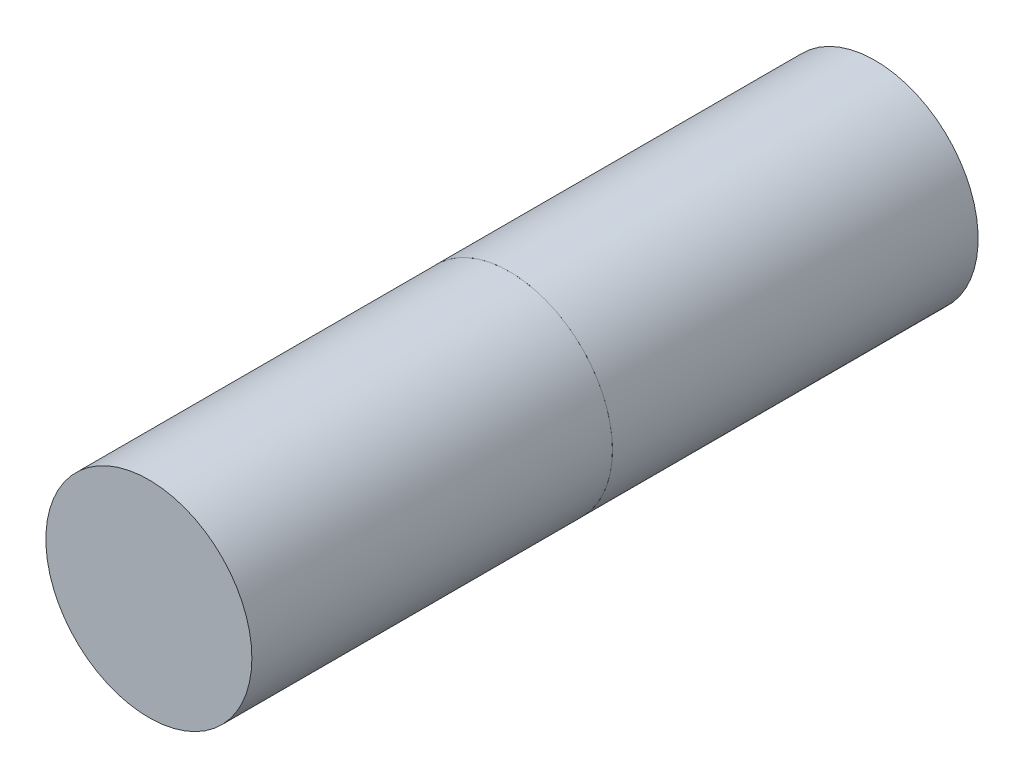
ISO-10303-21;
HEADER;
FILE_DESCRIPTION(('STEP AP214'),'2;1');
FILE_NAME('part.step','',(''),(''),'','','');
FILE_SCHEMA(('AUTOMOTIVE_DESIGN { 1 0 10303 214 1 1 1 1 }'));
ENDSEC;
DATA;
#1=APPLICATION_CONTEXT('core data for automotive mechanical design processes');
#2=APPLICATION_PROTOCOL_DEFINITION('international standard','automotive_design',2000,#1);
#3=PRODUCT_CONTEXT('',#1,'mechanical');
#4=PRODUCT('Part','Part','',(#3));
#5=PRODUCT_RELATED_PRODUCT_CATEGORY('part','',(#4));
#6=PRODUCT_DEFINITION_FORMATION('','',#4);
#7=PRODUCT_DEFINITION_CONTEXT('part definition',#1,'design');
#8=PRODUCT_DEFINITION('design','',#6,#7);
#9=PRODUCT_DEFINITION_SHAPE('','',#8);
#10=(LENGTH_UNIT() NAMED_UNIT(*) SI_UNIT(.MILLI.,.METRE.));
#11=(NAMED_UNIT(*) PLANE_ANGLE_UNIT() SI_UNIT($,.RADIAN.));
#12=(NAMED_UNIT(*) SI_UNIT($,.STERADIAN.) SOLID_ANGLE_UNIT());
#13=UNCERTAINTY_MEASURE_WITH_UNIT(LENGTH_MEASURE(1.E-05),#10,'distance_accuracy_value','');
#14=(GEOMETRIC_REPRESENTATION_CONTEXT(3) GLOBAL_UNCERTAINTY_ASSIGNED_CONTEXT((#13)) GLOBAL_UNIT_ASSIGNED_CONTEXT((#10,
#11,#12)) REPRESENTATION_CONTEXT('',''));
#15=CARTESIAN_POINT('',(0.,0.,0.));
#16=DIRECTION('',(0.,0.,1.));
#17=DIRECTION('',(1.,0.,0.));
#18=AXIS2_PLACEMENT_3D('',#15,#16,#17);
#19=CARTESIAN_POINT('',(0.,0.,-7.1));
#20=DIRECTION('',(0.,0.,1.));
#21=DIRECTION('',(1.,0.,0.));
#22=AXIS2_PLACEMENT_3D('',#19,#20,#21);
#23=CYLINDRICAL_SURFACE('',#22,2.);
#24=CARTESIAN_POINT('',(0.,0.,-7.1));
#25=DIRECTION('',(0.,0.,-1.));
#26=DIRECTION('',(-1.,0.,0.));
#27=AXIS2_PLACEMENT_3D('',#24,#25,#26);
#28=CIRCLE('',#27,2.);
#29=CARTESIAN_POINT('',(-2.,0.,-7.1));
#30=VERTEX_POINT('',#29);
#31=EDGE_CURVE('E11',#30,#30,#28,.T.);
#32=ORIENTED_EDGE('',*,*,#31,.F.);
#33=EDGE_LOOP('',(#32));
#34=FACE_BOUND('',#33,.T.);
#35=CARTESIAN_POINT('',(0.,0.,0.));
#36=DIRECTION('',(0.,0.,-1.));
#37=DIRECTION('',(-1.,0.,0.));
#38=AXIS2_PLACEMENT_3D('',#35,#36,#37);
#39=CIRCLE('',#38,2.);
#40=CARTESIAN_POINT('',(-2.,0.,0.));
#41=VERTEX_POINT('',#40);
#42=EDGE_CURVE('E54',#41,#41,#39,.T.);
#43=ORIENTED_EDGE('',*,*,#42,.T.);
#44=EDGE_LOOP('',(#43));
#45=FACE_BOUND('',#44,.T.);
#46=ADVANCED_FACE('F51',(#34,#45),#23,.T.);
#47=CARTESIAN_POINT('',(0.,0.,-7.1));
#48=DIRECTION('',(0.,0.,-1.));
#49=DIRECTION('',(-1.,0.,0.));
#50=AXIS2_PLACEMENT_3D('',#47,#48,#49);
#51=PLANE('',#50);
#52=ORIENTED_EDGE('',*,*,#31,.T.);
#53=EDGE_LOOP('',(#52));
#54=FACE_BOUND('',#53,.T.);
#55=ADVANCED_FACE('F68',(#54),#51,.T.);
#56=CARTESIAN_POINT('',(0.,0.,0.));
#57=DIRECTION('',(0.,0.,-1.));
#58=DIRECTION('',(-1.,0.,0.));
#59=AXIS2_PLACEMENT_3D('',#56,#57,#58);
#60=PLANE('',#59);
#61=ORIENTED_EDGE('',*,*,#42,.F.);
#62=EDGE_LOOP('',(#61));
#63=FACE_BOUND('',#62,.T.);
#64=ADVANCED_FACE('F66',(#63),#60,.F.);
#65=CLOSED_SHELL('',(#46,#55,#64));
#66=MANIFOLD_SOLID_BREP('B2',#65);
#67=CARTESIAN_POINT('',(0.,0.,7.));
#68=DIRECTION('',(0.,0.,-1.));
#69=DIRECTION('',(-1.,0.,0.));
#70=AXIS2_PLACEMENT_3D('',#67,#68,#69);
#71=CYLINDRICAL_SURFACE('',#70,2.);
#72=CARTESIAN_POINT('',(0.,0.,7.));
#73=DIRECTION('',(0.,0.,1.));
#74=DIRECTION('',(1.,0.,0.));
#75=AXIS2_PLACEMENT_3D('',#72,#73,#74);
#76=CIRCLE('',#75,2.);
#77=CARTESIAN_POINT('',(2.,0.,7.));
#78=VERTEX_POINT('',#77);
#79=EDGE_CURVE('E50',#78,#78,#76,.T.);
#80=ORIENTED_EDGE('',*,*,#79,.F.);
#81=EDGE_LOOP('',(#80));
#82=FACE_BOUND('',#81,.T.);
#83=CARTESIAN_POINT('',(0.,0.,0.));
#84=DIRECTION('',(0.,0.,1.));
#85=DIRECTION('',(1.,0.,0.));
#86=AXIS2_PLACEMENT_3D('',#83,#84,#85);
#87=CIRCLE('',#86,2.);
#88=CARTESIAN_POINT('',(2.,0.,0.));
#89=VERTEX_POINT('',#88);
#90=EDGE_CURVE('E103',#89,#89,#87,.T.);
#91=ORIENTED_EDGE('',*,*,#90,.T.);
#92=EDGE_LOOP('',(#91));
#93=FACE_BOUND('',#92,.T.);
#94=ADVANCED_FACE('F100',(#82,#93),#71,.T.);
#95=CARTESIAN_POINT('',(0.,0.,7.));
#96=DIRECTION('',(0.,0.,1.));
#97=DIRECTION('',(1.,0.,0.));
#98=AXIS2_PLACEMENT_3D('',#95,#96,#97);
#99=PLANE('',#98);
#100=ORIENTED_EDGE('',*,*,#79,.T.);
#101=EDGE_LOOP('',(#100));
#102=FACE_BOUND('',#101,.T.);
#103=ADVANCED_FACE('F115',(#102),#99,.T.);
#104=CARTESIAN_POINT('',(0.,0.,0.));
#105=DIRECTION('',(0.,0.,1.));
#106=DIRECTION('',(1.,0.,0.));
#107=AXIS2_PLACEMENT_3D('',#104,#105,#106);
#108=PLANE('',#107);
#109=ORIENTED_EDGE('',*,*,#90,.F.);
#110=EDGE_LOOP('',(#109));
#111=FACE_BOUND('',#110,.T.);
#112=ADVANCED_FACE('F113',(#111),#108,.F.);
#113=CLOSED_SHELL('',(#94,#103,#112));
#114=MANIFOLD_SOLID_BREP('B6',#113);
#115=ADVANCED_BREP_SHAPE_REPRESENTATION('',(#18,#66,#114),#14);
#116=SHAPE_DEFINITION_REPRESENTATION(#9,#115);
ENDSEC;
END-ISO-10303-21;
